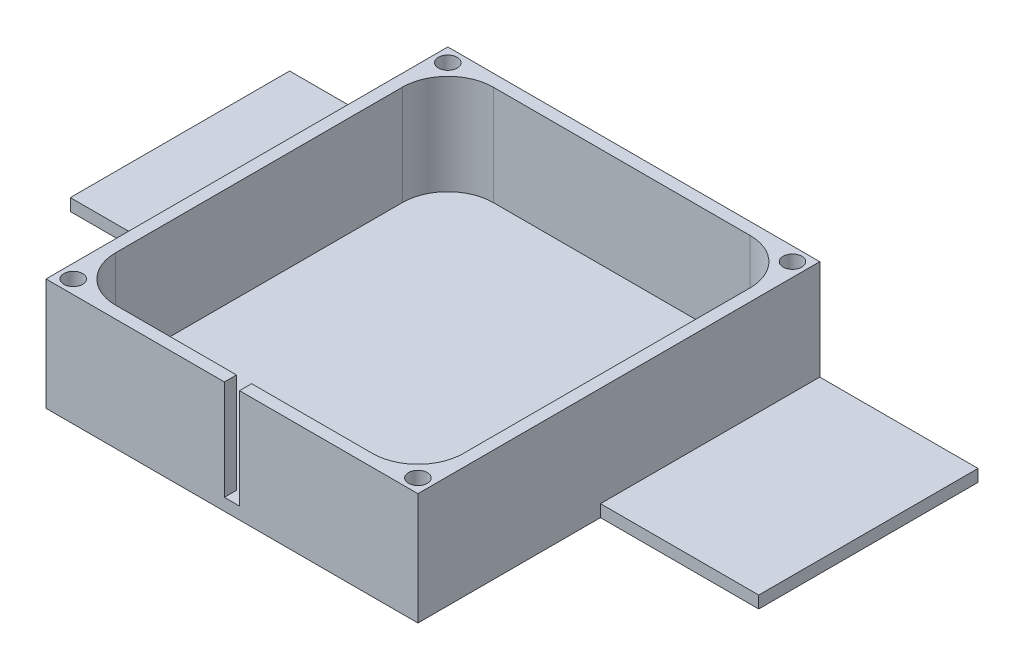
ISO-10303-21;
HEADER;
FILE_DESCRIPTION(('STEP AP214'),'2;1');
FILE_NAME('part.step','',(''),(''),'','','');
FILE_SCHEMA(('AUTOMOTIVE_DESIGN { 1 0 10303 214 1 1 1 1 }'));
ENDSEC;
DATA;
#1=APPLICATION_CONTEXT('core data for automotive mechanical design processes');
#2=APPLICATION_PROTOCOL_DEFINITION('international standard','automotive_design',2000,#1);
#3=PRODUCT_CONTEXT('',#1,'mechanical');
#4=PRODUCT('Part','Part','',(#3));
#5=PRODUCT_RELATED_PRODUCT_CATEGORY('part','',(#4));
#6=PRODUCT_DEFINITION_FORMATION('','',#4);
#7=PRODUCT_DEFINITION_CONTEXT('part definition',#1,'design');
#8=PRODUCT_DEFINITION('design','',#6,#7);
#9=PRODUCT_DEFINITION_SHAPE('','',#8);
#10=(LENGTH_UNIT() NAMED_UNIT(*) SI_UNIT(.MILLI.,.METRE.));
#11=(NAMED_UNIT(*) PLANE_ANGLE_UNIT() SI_UNIT($,.RADIAN.));
#12=(NAMED_UNIT(*) SI_UNIT($,.STERADIAN.) SOLID_ANGLE_UNIT());
#13=UNCERTAINTY_MEASURE_WITH_UNIT(LENGTH_MEASURE(1.E-05),#10,'distance_accuracy_value','');
#14=(GEOMETRIC_REPRESENTATION_CONTEXT(3) GLOBAL_UNCERTAINTY_ASSIGNED_CONTEXT((#13)) GLOBAL_UNIT_ASSIGNED_CONTEXT((#10,
#11,#12)) REPRESENTATION_CONTEXT('',''));
#15=CARTESIAN_POINT('',(0.,0.,0.));
#16=DIRECTION('',(0.,0.,1.));
#17=DIRECTION('',(1.,0.,0.));
#18=AXIS2_PLACEMENT_3D('',#15,#16,#17);
#19=CARTESIAN_POINT('',(0.,18.5,0.));
#20=DIRECTION('',(0.,1.,0.));
#21=DIRECTION('',(0.,0.,1.));
#22=AXIS2_PLACEMENT_3D('',#19,#20,#21);
#23=PLANE('',#22);
#24=CARTESIAN_POINT('',(81.7246461703273,18.5,57.3791379454559));
#25=DIRECTION('',(0.,-1.,0.));
#26=DIRECTION('',(0.,0.,-1.));
#27=AXIS2_PLACEMENT_3D('',#24,#25,#26);
#28=CIRCLE('',#27,1.55);
#29=CARTESIAN_POINT('',(81.7246461703273,18.5,55.8291379454559));
#30=VERTEX_POINT('',#29);
#31=EDGE_CURVE('E709',#30,#30,#28,.T.);
#32=ORIENTED_EDGE('',*,*,#31,.T.);
#33=EDGE_LOOP('',(#32));
#34=FACE_BOUND('',#33,.T.);
#35=CARTESIAN_POINT('',(24.8246461703273,18.5,57.3791379454559));
#36=DIRECTION('',(0.,1.,0.));
#37=DIRECTION('',(0.,0.,1.));
#38=AXIS2_PLACEMENT_3D('',#35,#36,#37);
#39=CIRCLE('',#38,1.55);
#40=CARTESIAN_POINT('',(24.8246461703273,18.5,58.9291379454559));
#41=VERTEX_POINT('',#40);
#42=EDGE_CURVE('E707',#41,#41,#39,.T.);
#43=ORIENTED_EDGE('',*,*,#42,.F.);
#44=EDGE_LOOP('',(#43));
#45=FACE_BOUND('',#44,.T.);
#46=DIRECTION('',(1.,0.,0.));
#47=VECTOR('',#46,1.);
#48=CARTESIAN_POINT('',(0.,18.5,119.469137945456));
#49=LINE('',#48,#47);
#50=CARTESIAN_POINT('',(54.5246461703273,18.5,119.469137945456));
#51=VERTEX_POINT('',#50);
#52=CARTESIAN_POINT('',(74.4746461703273,18.5,119.469137945456));
#53=VERTEX_POINT('',#52);
#54=EDGE_CURVE('E220',#51,#53,#49,.T.);
#55=ORIENTED_EDGE('',*,*,#54,.F.);
#56=DIRECTION('',(0.,0.,1.));
#57=VECTOR('',#56,1.);
#58=CARTESIAN_POINT('',(54.5246461703273,18.5,0.));
#59=LINE('',#58,#57);
#60=CARTESIAN_POINT('',(54.5246461703273,18.5,121.469137945456));
#61=VERTEX_POINT('',#60);
#62=EDGE_CURVE('E230',#51,#61,#59,.T.);
#63=ORIENTED_EDGE('',*,*,#62,.T.);
#64=DIRECTION('',(1.,0.,0.));
#65=VECTOR('',#64,1.);
#66=CARTESIAN_POINT('',(0.,18.5,121.469137945456));
#67=LINE('',#66,#65);
#68=CARTESIAN_POINT('',(83.9746461703273,18.5,121.469137945456));
#69=VERTEX_POINT('',#68);
#70=EDGE_CURVE('E235',#61,#69,#67,.T.);
#71=ORIENTED_EDGE('',*,*,#70,.T.);
#72=DIRECTION('',(0.,0.,-1.));
#73=VECTOR('',#72,1.);
#74=CARTESIAN_POINT('',(83.9746461703273,18.5,0.));
#75=LINE('',#74,#73);
#76=CARTESIAN_POINT('',(83.9746461703273,18.5,55.1291379454559));
#77=VERTEX_POINT('',#76);
#78=EDGE_CURVE('E455',#69,#77,#75,.T.);
#79=ORIENTED_EDGE('',*,*,#78,.T.);
#80=DIRECTION('',(-1.,0.,0.));
#81=VECTOR('',#80,1.);
#82=CARTESIAN_POINT('',(0.,18.5,55.1291379454559));
#83=LINE('',#82,#81);
#84=CARTESIAN_POINT('',(22.5746461703273,18.5,55.1291379454559));
#85=VERTEX_POINT('',#84);
#86=EDGE_CURVE('E456',#77,#85,#83,.T.);
#87=ORIENTED_EDGE('',*,*,#86,.T.);
#88=DIRECTION('',(0.,0.,-1.));
#89=VECTOR('',#88,1.);
#90=CARTESIAN_POINT('',(22.5746461703273,18.5,0.));
#91=LINE('',#90,#89);
#92=CARTESIAN_POINT('',(22.5746461703273,18.5,121.469137945456));
#93=VERTEX_POINT('',#92);
#94=EDGE_CURVE('E262',#93,#85,#91,.T.);
#95=ORIENTED_EDGE('',*,*,#94,.F.);
#96=CARTESIAN_POINT('',(52.0246461703273,18.5,121.469137945456));
#97=VERTEX_POINT('',#96);
#98=EDGE_CURVE('E257',#93,#97,#67,.T.);
#99=ORIENTED_EDGE('',*,*,#98,.T.);
#100=DIRECTION('',(0.,0.,1.));
#101=VECTOR('',#100,1.);
#102=CARTESIAN_POINT('',(52.0246461703273,18.5,0.));
#103=LINE('',#102,#101);
#104=CARTESIAN_POINT('',(52.0246461703273,18.5,119.469137945456));
#105=VERTEX_POINT('',#104);
#106=EDGE_CURVE('E249',#105,#97,#103,.T.);
#107=ORIENTED_EDGE('',*,*,#106,.F.);
#108=CARTESIAN_POINT('',(32.0746461703273,18.5,119.469137945456));
#109=VERTEX_POINT('',#108);
#110=EDGE_CURVE('E243',#109,#105,#49,.T.);
#111=ORIENTED_EDGE('',*,*,#110,.F.);
#112=CARTESIAN_POINT('',(32.0746461703273,18.5,111.969137945456));
#113=DIRECTION('',(0.,1.,0.));
#114=DIRECTION('',(0.,0.,1.));
#115=AXIS2_PLACEMENT_3D('',#112,#113,#114);
#116=CIRCLE('',#115,7.5);
#117=CARTESIAN_POINT('',(24.5746461703273,18.5,111.969137945456));
#118=VERTEX_POINT('',#117);
#119=EDGE_CURVE('E419',#109,#118,#116,.F.);
#120=ORIENTED_EDGE('',*,*,#119,.T.);
#121=DIRECTION('',(0.,0.,-1.));
#122=VECTOR('',#121,1.);
#123=CARTESIAN_POINT('',(24.5746461703273,18.5,0.));
#124=LINE('',#123,#122);
#125=CARTESIAN_POINT('',(24.5746461703273,18.5,64.6291379454559));
#126=VERTEX_POINT('',#125);
#127=EDGE_CURVE('E248',#118,#126,#124,.T.);
#128=ORIENTED_EDGE('',*,*,#127,.T.);
#129=CARTESIAN_POINT('',(32.0746461703273,18.5,64.6291379454559));
#130=DIRECTION('',(0.,1.,0.));
#131=DIRECTION('',(0.,0.,1.));
#132=AXIS2_PLACEMENT_3D('',#129,#130,#131);
#133=CIRCLE('',#132,7.5);
#134=CARTESIAN_POINT('',(32.0746461703273,18.5,57.1291379454559));
#135=VERTEX_POINT('',#134);
#136=EDGE_CURVE('E11',#126,#135,#133,.F.);
#137=ORIENTED_EDGE('',*,*,#136,.T.);
#138=DIRECTION('',(1.,0.,0.));
#139=VECTOR('',#138,1.);
#140=CARTESIAN_POINT('',(0.,18.5,57.1291379454559));
#141=LINE('',#140,#139);
#142=CARTESIAN_POINT('',(74.4746461703273,18.5,57.1291379454559));
#143=VERTEX_POINT('',#142);
#144=EDGE_CURVE('E254',#135,#143,#141,.T.);
#145=ORIENTED_EDGE('',*,*,#144,.T.);
#146=CARTESIAN_POINT('',(74.4746461703273,18.5,64.6291379454559));
#147=DIRECTION('',(0.,1.,0.));
#148=DIRECTION('',(0.,0.,1.));
#149=AXIS2_PLACEMENT_3D('',#146,#147,#148);
#150=CIRCLE('',#149,7.5);
#151=CARTESIAN_POINT('',(81.9746461703273,18.5,64.6291379454559));
#152=VERTEX_POINT('',#151);
#153=EDGE_CURVE('E49',#143,#152,#150,.F.);
#154=ORIENTED_EDGE('',*,*,#153,.T.);
#155=DIRECTION('',(0.,0.,-1.));
#156=VECTOR('',#155,1.);
#157=CARTESIAN_POINT('',(81.9746461703273,18.5,0.));
#158=LINE('',#157,#156);
#159=CARTESIAN_POINT('',(81.9746461703273,18.5,111.969137945456));
#160=VERTEX_POINT('',#159);
#161=EDGE_CURVE('E268',#160,#152,#158,.T.);
#162=ORIENTED_EDGE('',*,*,#161,.F.);
#163=CARTESIAN_POINT('',(74.4746461703273,18.5,111.969137945456));
#164=DIRECTION('',(0.,1.,0.));
#165=DIRECTION('',(0.,0.,1.));
#166=AXIS2_PLACEMENT_3D('',#163,#164,#165);
#167=CIRCLE('',#166,7.5);
#168=EDGE_CURVE('E240',#160,#53,#167,.F.);
#169=ORIENTED_EDGE('',*,*,#168,.T.);
#170=EDGE_LOOP('',(#55,#63,#71,#79,#87,#95,#99,#107,#111,#120,#128,#137,#145,#154,#162,#169));
#171=FACE_BOUND('',#170,.T.);
#172=CARTESIAN_POINT('',(81.7246461703273,18.5,119.219137945456));
#173=DIRECTION('',(0.,1.,0.));
#174=DIRECTION('',(0.,0.,1.));
#175=AXIS2_PLACEMENT_3D('',#172,#173,#174);
#176=CIRCLE('',#175,1.55);
#177=CARTESIAN_POINT('',(81.7246461703273,18.5,120.769137945456));
#178=VERTEX_POINT('',#177);
#179=EDGE_CURVE('E716',#178,#178,#176,.T.);
#180=ORIENTED_EDGE('',*,*,#179,.F.);
#181=EDGE_LOOP('',(#180));
#182=FACE_BOUND('',#181,.T.);
#183=CARTESIAN_POINT('',(24.8246461703273,18.5,119.219137945456));
#184=DIRECTION('',(0.,-1.,0.));
#185=DIRECTION('',(0.,0.,-1.));
#186=AXIS2_PLACEMENT_3D('',#183,#184,#185);
#187=CIRCLE('',#186,1.55);
#188=CARTESIAN_POINT('',(24.8246461703273,18.5,117.669137945456));
#189=VERTEX_POINT('',#188);
#190=EDGE_CURVE('E699',#189,#189,#187,.T.);
#191=ORIENTED_EDGE('',*,*,#190,.T.);
#192=EDGE_LOOP('',(#191));
#193=FACE_BOUND('',#192,.T.);
#194=ADVANCED_FACE('F41',(#34,#45,#171,#182,#193),#23,.T.);
#195=CARTESIAN_POINT('',(0.,2.,0.));
#196=DIRECTION('',(0.,1.,0.));
#197=DIRECTION('',(0.,0.,1.));
#198=AXIS2_PLACEMENT_3D('',#195,#196,#197);
#199=PLANE('',#198);
#200=DIRECTION('',(1.,0.,0.));
#201=VECTOR('',#200,1.);
#202=CARTESIAN_POINT('',(0.,2.,91.3291379454559));
#203=LINE('',#202,#201);
#204=CARTESIAN_POINT('',(-3.55035382967264,2.,91.3291379454559));
#205=VERTEX_POINT('',#204);
#206=CARTESIAN_POINT('',(22.5746461703273,2.,91.3291379454559));
#207=VERTEX_POINT('',#206);
#208=EDGE_CURVE('E313',#205,#207,#203,.T.);
#209=ORIENTED_EDGE('',*,*,#208,.T.);
#210=DIRECTION('',(0.,0.,-1.));
#211=VECTOR('',#210,1.);
#212=CARTESIAN_POINT('',(22.5746461703273,2.,0.));
#213=LINE('',#212,#211);
#214=CARTESIAN_POINT('',(22.5746461703273,2.,55.1291379454559));
#215=VERTEX_POINT('',#214);
#216=EDGE_CURVE('E285',#207,#215,#213,.T.);
#217=ORIENTED_EDGE('',*,*,#216,.T.);
#218=DIRECTION('',(1.,0.,0.));
#219=VECTOR('',#218,1.);
#220=CARTESIAN_POINT('',(0.,2.,55.1291379454559));
#221=LINE('',#220,#219);
#222=CARTESIAN_POINT('',(-3.55035382967265,2.,55.1291379454559));
#223=VERTEX_POINT('',#222);
#224=EDGE_CURVE('E306',#223,#215,#221,.T.);
#225=ORIENTED_EDGE('',*,*,#224,.F.);
#226=DIRECTION('',(0.,0.,1.));
#227=VECTOR('',#226,1.);
#228=CARTESIAN_POINT('',(-3.55035382967266,2.,0.));
#229=LINE('',#228,#227);
#230=EDGE_CURVE('E310',#223,#205,#229,.T.);
#231=ORIENTED_EDGE('',*,*,#230,.T.);
#232=EDGE_LOOP('',(#209,#217,#225,#231));
#233=FACE_BOUND('',#232,.T.);
#234=ADVANCED_FACE('F485',(#233),#199,.T.);
#235=DIRECTION('',(-1.,0.,0.));
#236=VECTOR('',#235,1.);
#237=CARTESIAN_POINT('',(0.,2.,55.1291379454559));
#238=LINE('',#237,#236);
#239=CARTESIAN_POINT('',(64.0437198896757,2.,55.1291379454559));
#240=VERTEX_POINT('',#239);
#241=CARTESIAN_POINT('',(42.2796461703273,2.,55.1291379454559));
#242=VERTEX_POINT('',#241);
#243=EDGE_CURVE('E281',#240,#242,#238,.T.);
#244=ORIENTED_EDGE('',*,*,#243,.F.);
#245=DIRECTION('',(0.,0.,-1.));
#246=VECTOR('',#245,1.);
#247=CARTESIAN_POINT('',(64.0437198896756,2.,-1.11098144381503E-13));
#248=LINE('',#247,#246);
#249=CARTESIAN_POINT('',(64.0437198896757,2.,47.1291379454559));
#250=VERTEX_POINT('',#249);
#251=EDGE_CURVE('E322',#240,#250,#248,.T.);
#252=ORIENTED_EDGE('',*,*,#251,.T.);
#253=DIRECTION('',(1.,0.,0.));
#254=VECTOR('',#253,1.);
#255=CARTESIAN_POINT('',(0.,2.,47.1291379454559));
#256=LINE('',#255,#254);
#257=CARTESIAN_POINT('',(42.2796461703274,2.,47.1291379454559));
#258=VERTEX_POINT('',#257);
#259=EDGE_CURVE('E324',#258,#250,#256,.T.);
#260=ORIENTED_EDGE('',*,*,#259,.F.);
#261=DIRECTION('',(0.,0.,-1.));
#262=VECTOR('',#261,1.);
#263=CARTESIAN_POINT('',(42.2796461703274,2.,0.));
#264=LINE('',#263,#262);
#265=EDGE_CURVE('E303',#242,#258,#264,.T.);
#266=ORIENTED_EDGE('',*,*,#265,.F.);
#267=EDGE_LOOP('',(#244,#252,#260,#266));
#268=FACE_BOUND('',#267,.T.);
#269=CARTESIAN_POINT('',(46.2796461703273,2.,51.1291379454559));
#270=DIRECTION('',(0.,1.,0.));
#271=DIRECTION('',(0.,0.,1.));
#272=AXIS2_PLACEMENT_3D('',#269,#270,#271);
#273=CIRCLE('',#272,1.55);
#274=CARTESIAN_POINT('',(46.2796461703273,2.,52.6791379454559));
#275=VERTEX_POINT('',#274);
#276=EDGE_CURVE('E327',#275,#275,#273,.T.);
#277=ORIENTED_EDGE('',*,*,#276,.F.);
#278=EDGE_LOOP('',(#277));
#279=FACE_BOUND('',#278,.T.);
#280=CARTESIAN_POINT('',(60.0437198896757,2.,51.1291379454559));
#281=DIRECTION('',(0.,1.,0.));
#282=DIRECTION('',(0.,0.,1.));
#283=AXIS2_PLACEMENT_3D('',#280,#281,#282);
#284=CIRCLE('',#283,1.55);
#285=CARTESIAN_POINT('',(60.0437198896757,2.,52.6791379454559));
#286=VERTEX_POINT('',#285);
#287=EDGE_CURVE('E330',#286,#286,#284,.F.);
#288=ORIENTED_EDGE('',*,*,#287,.T.);
#289=EDGE_LOOP('',(#288));
#290=FACE_BOUND('',#289,.T.);
#291=ADVANCED_FACE('F532',(#268,#279,#290),#199,.T.);
#292=DIRECTION('',(0.,0.,-1.));
#293=VECTOR('',#292,1.);
#294=CARTESIAN_POINT('',(24.5746461703273,2.,0.));
#295=LINE('',#294,#293);
#296=CARTESIAN_POINT('',(24.5746461703273,2.,111.969137945456));
#297=VERTEX_POINT('',#296);
#298=CARTESIAN_POINT('',(24.5746461703273,2.,64.6291379454559));
#299=VERTEX_POINT('',#298);
#300=EDGE_CURVE('E289',#297,#299,#295,.T.);
#301=ORIENTED_EDGE('',*,*,#300,.F.);
#302=CARTESIAN_POINT('',(32.0746461703273,2.,111.969137945456));
#303=DIRECTION('',(0.,1.,0.));
#304=DIRECTION('',(0.,0.,1.));
#305=AXIS2_PLACEMENT_3D('',#302,#303,#304);
#306=CIRCLE('',#305,7.5);
#307=CARTESIAN_POINT('',(32.0746461703273,2.,119.469137945456));
#308=VERTEX_POINT('',#307);
#309=EDGE_CURVE('E404',#297,#308,#306,.T.);
#310=ORIENTED_EDGE('',*,*,#309,.T.);
#311=DIRECTION('',(1.,0.,0.));
#312=VECTOR('',#311,1.);
#313=CARTESIAN_POINT('',(0.,2.,119.469137945456));
#314=LINE('',#313,#312);
#315=CARTESIAN_POINT('',(52.0246461703273,2.,119.469137945456));
#316=VERTEX_POINT('',#315);
#317=EDGE_CURVE('E275',#308,#316,#314,.T.);
#318=ORIENTED_EDGE('',*,*,#317,.T.);
#319=DIRECTION('',(0.,0.,1.));
#320=VECTOR('',#319,1.);
#321=CARTESIAN_POINT('',(52.0246461703273,2.,0.));
#322=LINE('',#321,#320);
#323=CARTESIAN_POINT('',(52.0246461703273,2.,121.469137945456));
#324=VERTEX_POINT('',#323);
#325=EDGE_CURVE('E277',#316,#324,#322,.T.);
#326=ORIENTED_EDGE('',*,*,#325,.T.);
#327=DIRECTION('',(1.,0.,0.));
#328=VECTOR('',#327,1.);
#329=CARTESIAN_POINT('',(0.,2.,121.469137945456));
#330=LINE('',#329,#328);
#331=CARTESIAN_POINT('',(54.5246461703273,2.,121.469137945456));
#332=VERTEX_POINT('',#331);
#333=EDGE_CURVE('E315',#324,#332,#330,.T.);
#334=ORIENTED_EDGE('',*,*,#333,.T.);
#335=DIRECTION('',(0.,0.,1.));
#336=VECTOR('',#335,1.);
#337=CARTESIAN_POINT('',(54.5246461703273,2.,0.));
#338=LINE('',#337,#336);
#339=CARTESIAN_POINT('',(54.5246461703273,2.,119.469137945456));
#340=VERTEX_POINT('',#339);
#341=EDGE_CURVE('E273',#340,#332,#338,.T.);
#342=ORIENTED_EDGE('',*,*,#341,.F.);
#343=CARTESIAN_POINT('',(74.4746461703273,2.,119.469137945456));
#344=VERTEX_POINT('',#343);
#345=EDGE_CURVE('E223',#340,#344,#314,.T.);
#346=ORIENTED_EDGE('',*,*,#345,.T.);
#347=CARTESIAN_POINT('',(74.4746461703273,2.,111.969137945456));
#348=DIRECTION('',(0.,1.,0.));
#349=DIRECTION('',(0.,0.,1.));
#350=AXIS2_PLACEMENT_3D('',#347,#348,#349);
#351=CIRCLE('',#350,7.5);
#352=CARTESIAN_POINT('',(81.9746461703273,2.,111.969137945456));
#353=VERTEX_POINT('',#352);
#354=EDGE_CURVE('E402',#344,#353,#351,.T.);
#355=ORIENTED_EDGE('',*,*,#354,.T.);
#356=DIRECTION('',(0.,0.,-1.));
#357=VECTOR('',#356,1.);
#358=CARTESIAN_POINT('',(81.9746461703273,2.,0.));
#359=LINE('',#358,#357);
#360=CARTESIAN_POINT('',(81.9746461703273,2.,64.6291379454559));
#361=VERTEX_POINT('',#360);
#362=EDGE_CURVE('E241',#353,#361,#359,.T.);
#363=ORIENTED_EDGE('',*,*,#362,.T.);
#364=CARTESIAN_POINT('',(74.4746461703273,2.,64.6291379454559));
#365=DIRECTION('',(0.,1.,0.));
#366=DIRECTION('',(0.,0.,1.));
#367=AXIS2_PLACEMENT_3D('',#364,#365,#366);
#368=CIRCLE('',#367,7.5);
#369=CARTESIAN_POINT('',(74.4746461703273,2.,57.1291379454559));
#370=VERTEX_POINT('',#369);
#371=EDGE_CURVE('E400',#361,#370,#368,.T.);
#372=ORIENTED_EDGE('',*,*,#371,.T.);
#373=DIRECTION('',(1.,0.,0.));
#374=VECTOR('',#373,1.);
#375=CARTESIAN_POINT('',(0.,2.,57.1291379454559));
#376=LINE('',#375,#374);
#377=CARTESIAN_POINT('',(32.0746461703273,2.,57.1291379454559));
#378=VERTEX_POINT('',#377);
#379=EDGE_CURVE('E245',#378,#370,#376,.T.);
#380=ORIENTED_EDGE('',*,*,#379,.F.);
#381=CARTESIAN_POINT('',(32.0746461703273,2.,64.6291379454559));
#382=DIRECTION('',(0.,1.,0.));
#383=DIRECTION('',(0.,0.,1.));
#384=AXIS2_PLACEMENT_3D('',#381,#382,#383);
#385=CIRCLE('',#384,7.5);
#386=EDGE_CURVE('E398',#378,#299,#385,.T.);
#387=ORIENTED_EDGE('',*,*,#386,.T.);
#388=EDGE_LOOP('',(#301,#310,#318,#326,#334,#342,#346,#355,#363,#372,#380,#387));
#389=FACE_BOUND('',#388,.T.);
#390=ADVANCED_FACE('F432',(#389),#199,.T.);
#391=CARTESIAN_POINT('',(42.2796461703274,2.,0.));
#392=DIRECTION('',(-1.,0.,0.));
#393=DIRECTION('',(0.,0.,1.));
#394=AXIS2_PLACEMENT_3D('',#391,#392,#393);
#395=PLANE('',#394);
#396=DIRECTION('',(0.,0.,-1.));
#397=VECTOR('',#396,1.);
#398=CARTESIAN_POINT('',(42.2796461703274,0.,0.));
#399=LINE('',#398,#397);
#400=CARTESIAN_POINT('',(42.2796461703273,0.,55.1291379454559));
#401=VERTEX_POINT('',#400);
#402=CARTESIAN_POINT('',(42.2796461703274,0.,47.1291379454559));
#403=VERTEX_POINT('',#402);
#404=EDGE_CURVE('E226',#401,#403,#399,.T.);
#405=ORIENTED_EDGE('',*,*,#404,.F.);
#406=DIRECTION('',(0.,-1.,0.));
#407=VECTOR('',#406,1.);
#408=CARTESIAN_POINT('',(42.2796461703273,2.,55.1291379454559));
#409=LINE('',#408,#407);
#410=EDGE_CURVE('E282',#242,#401,#409,.T.);
#411=ORIENTED_EDGE('',*,*,#410,.F.);
#412=ORIENTED_EDGE('',*,*,#265,.T.);
#413=DIRECTION('',(0.,-1.,0.));
#414=VECTOR('',#413,1.);
#415=CARTESIAN_POINT('',(42.2796461703274,2.,47.1291379454559));
#416=LINE('',#415,#414);
#417=EDGE_CURVE('E333',#258,#403,#416,.T.);
#418=ORIENTED_EDGE('',*,*,#417,.T.);
#419=EDGE_LOOP('',(#405,#411,#412,#418));
#420=FACE_BOUND('',#419,.T.);
#421=ADVANCED_FACE('F497',(#420),#395,.T.);
#422=CARTESIAN_POINT('',(-3.55035382967266,2.,0.));
#423=DIRECTION('',(1.,0.,0.));
#424=DIRECTION('',(0.,0.,-1.));
#425=AXIS2_PLACEMENT_3D('',#422,#423,#424);
#426=PLANE('',#425);
#427=DIRECTION('',(0.,0.,1.));
#428=VECTOR('',#427,1.);
#429=CARTESIAN_POINT('',(-3.55035382967266,0.,0.));
#430=LINE('',#429,#428);
#431=CARTESIAN_POINT('',(-3.55035382967265,0.,55.1291379454559));
#432=VERTEX_POINT('',#431);
#433=CARTESIAN_POINT('',(-3.55035382967264,0.,91.3291379454559));
#434=VERTEX_POINT('',#433);
#435=EDGE_CURVE('E339',#432,#434,#430,.T.);
#436=ORIENTED_EDGE('',*,*,#435,.T.);
#437=DIRECTION('',(0.,-1.,0.));
#438=VECTOR('',#437,1.);
#439=CARTESIAN_POINT('',(-3.55035382967264,2.,91.3291379454559));
#440=LINE('',#439,#438);
#441=EDGE_CURVE('E388',#205,#434,#440,.T.);
#442=ORIENTED_EDGE('',*,*,#441,.F.);
#443=ORIENTED_EDGE('',*,*,#230,.F.);
#444=DIRECTION('',(0.,-1.,0.));
#445=VECTOR('',#444,1.);
#446=CARTESIAN_POINT('',(-3.55035382967265,2.,55.1291379454559));
#447=LINE('',#446,#445);
#448=EDGE_CURVE('E391',#223,#432,#447,.T.);
#449=ORIENTED_EDGE('',*,*,#448,.T.);
#450=EDGE_LOOP('',(#436,#442,#443,#449));
#451=FACE_BOUND('',#450,.T.);
#452=ADVANCED_FACE('F862',(#451),#426,.F.);
#453=CARTESIAN_POINT('',(0.,2.,91.3291379454559));
#454=DIRECTION('',(0.,0.,-1.));
#455=DIRECTION('',(-1.,0.,0.));
#456=AXIS2_PLACEMENT_3D('',#453,#454,#455);
#457=PLANE('',#456);
#458=DIRECTION('',(1.,0.,0.));
#459=VECTOR('',#458,1.);
#460=CARTESIAN_POINT('',(0.,0.,91.3291379454559));
#461=LINE('',#460,#459);
#462=CARTESIAN_POINT('',(22.5746461703273,0.,91.3291379454559));
#463=VERTEX_POINT('',#462);
#464=EDGE_CURVE('E342',#434,#463,#461,.T.);
#465=ORIENTED_EDGE('',*,*,#464,.T.);
#466=DIRECTION('',(0.,-1.,0.));
#467=VECTOR('',#466,1.);
#468=CARTESIAN_POINT('',(22.5746461703273,2.,91.3291379454559));
#469=LINE('',#468,#467);
#470=EDGE_CURVE('E385',#207,#463,#469,.T.);
#471=ORIENTED_EDGE('',*,*,#470,.F.);
#472=ORIENTED_EDGE('',*,*,#208,.F.);
#473=ORIENTED_EDGE('',*,*,#441,.T.);
#474=EDGE_LOOP('',(#465,#471,#472,#473));
#475=FACE_BOUND('',#474,.T.);
#476=ADVANCED_FACE('F490',(#475),#457,.F.);
#477=CARTESIAN_POINT('',(22.5746461703273,2.,0.));
#478=DIRECTION('',(1.,0.,0.));
#479=DIRECTION('',(0.,0.,-1.));
#480=AXIS2_PLACEMENT_3D('',#477,#478,#479);
#481=PLANE('',#480);
#482=DIRECTION('',(0.,0.,1.));
#483=VECTOR('',#482,1.);
#484=CARTESIAN_POINT('',(22.5746461703273,0.,0.));
#485=LINE('',#484,#483);
#486=CARTESIAN_POINT('',(22.5746461703273,0.,121.469137945456));
#487=VERTEX_POINT('',#486);
#488=EDGE_CURVE('E344',#463,#487,#485,.T.);
#489=ORIENTED_EDGE('',*,*,#488,.T.);
#490=DIRECTION('',(0.,-1.,0.));
#491=VECTOR('',#490,1.);
#492=CARTESIAN_POINT('',(22.5746461703273,2.,121.469137945456));
#493=LINE('',#492,#491);
#494=EDGE_CURVE('E382',#93,#487,#493,.T.);
#495=ORIENTED_EDGE('',*,*,#494,.F.);
#496=ORIENTED_EDGE('',*,*,#94,.T.);
#497=DIRECTION('',(0.,-1.,0.));
#498=VECTOR('',#497,1.);
#499=CARTESIAN_POINT('',(22.5746461703273,18.5,55.1291379454559));
#500=LINE('',#499,#498);
#501=EDGE_CURVE('E296',#85,#215,#500,.T.);
#502=ORIENTED_EDGE('',*,*,#501,.T.);
#503=ORIENTED_EDGE('',*,*,#216,.F.);
#504=ORIENTED_EDGE('',*,*,#470,.T.);
#505=EDGE_LOOP('',(#489,#495,#496,#502,#503,#504));
#506=FACE_BOUND('',#505,.T.);
#507=ADVANCED_FACE('F463',(#506),#481,.F.);
#508=CARTESIAN_POINT('',(0.,2.,121.469137945456));
#509=DIRECTION('',(0.,0.,-1.));
#510=DIRECTION('',(-1.,0.,0.));
#511=AXIS2_PLACEMENT_3D('',#508,#509,#510);
#512=PLANE('',#511);
#513=DIRECTION('',(1.,0.,0.));
#514=VECTOR('',#513,1.);
#515=CARTESIAN_POINT('',(0.,0.,121.469137945456));
#516=LINE('',#515,#514);
#517=CARTESIAN_POINT('',(83.9746461703273,0.,121.469137945456));
#518=VERTEX_POINT('',#517);
#519=EDGE_CURVE('E346',#487,#518,#516,.T.);
#520=ORIENTED_EDGE('',*,*,#519,.T.);
#521=DIRECTION('',(0.,-1.,0.));
#522=VECTOR('',#521,1.);
#523=CARTESIAN_POINT('',(83.9746461703273,2.,121.469137945456));
#524=LINE('',#523,#522);
#525=EDGE_CURVE('E380',#69,#518,#524,.T.);
#526=ORIENTED_EDGE('',*,*,#525,.F.);
#527=ORIENTED_EDGE('',*,*,#70,.F.);
#528=DIRECTION('',(0.,-1.,0.));
#529=VECTOR('',#528,1.);
#530=CARTESIAN_POINT('',(54.5246461703273,18.5,121.469137945456));
#531=LINE('',#530,#529);
#532=EDGE_CURVE('E227',#61,#332,#531,.T.);
#533=ORIENTED_EDGE('',*,*,#532,.T.);
#534=ORIENTED_EDGE('',*,*,#333,.F.);
#535=DIRECTION('',(0.,-1.,0.));
#536=VECTOR('',#535,1.);
#537=CARTESIAN_POINT('',(52.0246461703273,18.5,121.469137945456));
#538=LINE('',#537,#536);
#539=EDGE_CURVE('E294',#97,#324,#538,.T.);
#540=ORIENTED_EDGE('',*,*,#539,.F.);
#541=ORIENTED_EDGE('',*,*,#98,.F.);
#542=ORIENTED_EDGE('',*,*,#494,.T.);
#543=EDGE_LOOP('',(#520,#526,#527,#533,#534,#540,#541,#542));
#544=FACE_BOUND('',#543,.T.);
#545=ADVANCED_FACE('F452',(#544),#512,.F.);
#546=CARTESIAN_POINT('',(83.9746461703273,2.,0.));
#547=DIRECTION('',(1.,0.,0.));
#548=DIRECTION('',(0.,0.,-1.));
#549=AXIS2_PLACEMENT_3D('',#546,#547,#548);
#550=PLANE('',#549);
#551=DIRECTION('',(0.,0.,1.));
#552=VECTOR('',#551,1.);
#553=CARTESIAN_POINT('',(83.9746461703273,0.,0.));
#554=LINE('',#553,#552);
#555=CARTESIAN_POINT('',(83.9746461703273,0.,91.3291379454559));
#556=VERTEX_POINT('',#555);
#557=EDGE_CURVE('E349',#556,#518,#554,.T.);
#558=ORIENTED_EDGE('',*,*,#557,.F.);
#559=DIRECTION('',(0.,-1.,0.));
#560=VECTOR('',#559,1.);
#561=CARTESIAN_POINT('',(83.9746461703273,2.,91.3291379454559));
#562=LINE('',#561,#560);
#563=CARTESIAN_POINT('',(83.9746461703273,2.,91.3291379454559));
#564=VERTEX_POINT('',#563);
#565=EDGE_CURVE('E378',#564,#556,#562,.T.);
#566=ORIENTED_EDGE('',*,*,#565,.F.);
#567=DIRECTION('',(0.,0.,-1.));
#568=VECTOR('',#567,1.);
#569=CARTESIAN_POINT('',(83.9746461703273,2.,0.));
#570=LINE('',#569,#568);
#571=CARTESIAN_POINT('',(83.9746461703273,2.,55.1291379454559));
#572=VERTEX_POINT('',#571);
#573=EDGE_CURVE('E278',#564,#572,#570,.T.);
#574=ORIENTED_EDGE('',*,*,#573,.T.);
#575=DIRECTION('',(0.,-1.,0.));
#576=VECTOR('',#575,1.);
#577=CARTESIAN_POINT('',(83.9746461703273,18.5,55.1291379454559));
#578=LINE('',#577,#576);
#579=EDGE_CURVE('E299',#77,#572,#578,.T.);
#580=ORIENTED_EDGE('',*,*,#579,.F.);
#581=ORIENTED_EDGE('',*,*,#78,.F.);
#582=ORIENTED_EDGE('',*,*,#525,.T.);
#583=EDGE_LOOP('',(#558,#566,#574,#580,#581,#582));
#584=FACE_BOUND('',#583,.T.);
#585=ADVANCED_FACE('F475',(#584),#550,.T.);
#586=CARTESIAN_POINT('',(0.,2.,91.3291379454559));
#587=DIRECTION('',(0.,0.,-1.));
#588=DIRECTION('',(-1.,0.,0.));
#589=AXIS2_PLACEMENT_3D('',#586,#587,#588);
#590=PLANE('',#589);
#591=DIRECTION('',(1.,0.,0.));
#592=VECTOR('',#591,1.);
#593=CARTESIAN_POINT('',(0.,0.,91.3291379454559));
#594=LINE('',#593,#592);
#595=CARTESIAN_POINT('',(110.099646170327,0.,91.3291379454559));
#596=VERTEX_POINT('',#595);
#597=EDGE_CURVE('E352',#556,#596,#594,.T.);
#598=ORIENTED_EDGE('',*,*,#597,.T.);
#599=DIRECTION('',(0.,-1.,0.));
#600=VECTOR('',#599,1.);
#601=CARTESIAN_POINT('',(110.099646170327,2.,91.3291379454559));
#602=LINE('',#601,#600);
#603=CARTESIAN_POINT('',(110.099646170327,2.,91.3291379454559));
#604=VERTEX_POINT('',#603);
#605=EDGE_CURVE('E376',#604,#596,#602,.T.);
#606=ORIENTED_EDGE('',*,*,#605,.F.);
#607=DIRECTION('',(1.,0.,0.));
#608=VECTOR('',#607,1.);
#609=CARTESIAN_POINT('',(0.,2.,91.3291379454559));
#610=LINE('',#609,#608);
#611=EDGE_CURVE('E317',#564,#604,#610,.T.);
#612=ORIENTED_EDGE('',*,*,#611,.F.);
#613=ORIENTED_EDGE('',*,*,#565,.T.);
#614=EDGE_LOOP('',(#598,#606,#612,#613));
#615=FACE_BOUND('',#614,.T.);
#616=ADVANCED_FACE('F515',(#615),#590,.F.);
#617=CARTESIAN_POINT('',(110.099646170327,2.,0.));
#618=DIRECTION('',(1.,0.,0.));
#619=DIRECTION('',(0.,0.,-1.));
#620=AXIS2_PLACEMENT_3D('',#617,#618,#619);
#621=PLANE('',#620);
#622=DIRECTION('',(0.,0.,1.));
#623=VECTOR('',#622,1.);
#624=CARTESIAN_POINT('',(110.099646170327,0.,0.));
#625=LINE('',#624,#623);
#626=CARTESIAN_POINT('',(110.099646170327,0.,55.1291379454559));
#627=VERTEX_POINT('',#626);
#628=EDGE_CURVE('E355',#627,#596,#625,.T.);
#629=ORIENTED_EDGE('',*,*,#628,.F.);
#630=DIRECTION('',(0.,-1.,0.));
#631=VECTOR('',#630,1.);
#632=CARTESIAN_POINT('',(110.099646170327,2.,55.1291379454559));
#633=LINE('',#632,#631);
#634=CARTESIAN_POINT('',(110.099646170327,2.,55.1291379454559));
#635=VERTEX_POINT('',#634);
#636=EDGE_CURVE('E374',#635,#627,#633,.T.);
#637=ORIENTED_EDGE('',*,*,#636,.F.);
#638=DIRECTION('',(0.,0.,1.));
#639=VECTOR('',#638,1.);
#640=CARTESIAN_POINT('',(110.099646170327,2.,0.));
#641=LINE('',#640,#639);
#642=EDGE_CURVE('E319',#635,#604,#641,.T.);
#643=ORIENTED_EDGE('',*,*,#642,.T.);
#644=ORIENTED_EDGE('',*,*,#605,.T.);
#645=EDGE_LOOP('',(#629,#637,#643,#644));
#646=FACE_BOUND('',#645,.T.);
#647=ADVANCED_FACE('F512',(#646),#621,.T.);
#648=CARTESIAN_POINT('',(0.,2.,55.1291379454559));
#649=DIRECTION('',(0.,0.,-1.));
#650=DIRECTION('',(-1.,0.,0.));
#651=AXIS2_PLACEMENT_3D('',#648,#649,#650);
#652=PLANE('',#651);
#653=DIRECTION('',(1.,0.,0.));
#654=VECTOR('',#653,1.);
#655=CARTESIAN_POINT('',(0.,0.,55.1291379454559));
#656=LINE('',#655,#654);
#657=CARTESIAN_POINT('',(64.0437198896757,0.,55.1291379454559));
#658=VERTEX_POINT('',#657);
#659=EDGE_CURVE('E340',#658,#627,#656,.T.);
#660=ORIENTED_EDGE('',*,*,#659,.F.);
#661=DIRECTION('',(0.,-1.,0.));
#662=VECTOR('',#661,1.);
#663=CARTESIAN_POINT('',(64.0437198896757,2.,55.1291379454559));
#664=LINE('',#663,#662);
#665=EDGE_CURVE('E372',#240,#658,#664,.T.);
#666=ORIENTED_EDGE('',*,*,#665,.F.);
#667=ORIENTED_EDGE('',*,*,#243,.T.);
#668=ORIENTED_EDGE('',*,*,#410,.T.);
#669=EDGE_CURVE('E336',#432,#401,#656,.T.);
#670=ORIENTED_EDGE('',*,*,#669,.F.);
#671=ORIENTED_EDGE('',*,*,#448,.F.);
#672=ORIENTED_EDGE('',*,*,#224,.T.);
#673=ORIENTED_EDGE('',*,*,#501,.F.);
#674=ORIENTED_EDGE('',*,*,#86,.F.);
#675=ORIENTED_EDGE('',*,*,#579,.T.);
#676=EDGE_CURVE('E311',#572,#635,#221,.T.);
#677=ORIENTED_EDGE('',*,*,#676,.T.);
#678=ORIENTED_EDGE('',*,*,#636,.T.);
#679=EDGE_LOOP('',(#660,#666,#667,#668,#670,#671,#672,#673,#674,#675,#677,#678));
#680=FACE_BOUND('',#679,.T.);
#681=ADVANCED_FACE('F480',(#680),#652,.T.);
#682=CARTESIAN_POINT('',(64.0437198896756,2.,-1.11098144381503E-13));
#683=DIRECTION('',(-1.,0.,0.));
#684=DIRECTION('',(0.,0.,1.));
#685=AXIS2_PLACEMENT_3D('',#682,#683,#684);
#686=PLANE('',#685);
#687=DIRECTION('',(0.,0.,-1.));
#688=VECTOR('',#687,1.);
#689=CARTESIAN_POINT('',(64.0437198896756,0.,-1.11098144381503E-13));
#690=LINE('',#689,#688);
#691=CARTESIAN_POINT('',(64.0437198896757,0.,47.1291379454559));
#692=VERTEX_POINT('',#691);
#693=EDGE_CURVE('E358',#658,#692,#690,.T.);
#694=ORIENTED_EDGE('',*,*,#693,.T.);
#695=DIRECTION('',(0.,-1.,0.));
#696=VECTOR('',#695,1.);
#697=CARTESIAN_POINT('',(64.0437198896757,2.,47.1291379454559));
#698=LINE('',#697,#696);
#699=EDGE_CURVE('E370',#250,#692,#698,.T.);
#700=ORIENTED_EDGE('',*,*,#699,.F.);
#701=ORIENTED_EDGE('',*,*,#251,.F.);
#702=ORIENTED_EDGE('',*,*,#665,.T.);
#703=EDGE_LOOP('',(#694,#700,#701,#702));
#704=FACE_BOUND('',#703,.T.);
#705=ADVANCED_FACE('F506',(#704),#686,.F.);
#706=CARTESIAN_POINT('',(46.2796461703273,2.,51.1291379454559));
#707=DIRECTION('',(0.,-1.,0.));
#708=DIRECTION('',(0.,0.,-1.));
#709=AXIS2_PLACEMENT_3D('',#706,#707,#708);
#710=CYLINDRICAL_SURFACE('',#709,1.55);
#711=ORIENTED_EDGE('',*,*,#276,.T.);
#712=EDGE_LOOP('',(#711));
#713=FACE_BOUND('',#712,.T.);
#714=CARTESIAN_POINT('',(46.2796461703273,0.,51.1291379454559));
#715=DIRECTION('',(0.,1.,0.));
#716=DIRECTION('',(0.,0.,1.));
#717=AXIS2_PLACEMENT_3D('',#714,#715,#716);
#718=CIRCLE('',#717,1.55);
#719=CARTESIAN_POINT('',(46.2796461703273,0.,52.6791379454559));
#720=VERTEX_POINT('',#719);
#721=EDGE_CURVE('E364',#720,#720,#718,.T.);
#722=ORIENTED_EDGE('',*,*,#721,.F.);
#723=EDGE_LOOP('',(#722));
#724=FACE_BOUND('',#723,.T.);
#725=ADVANCED_FACE('F793',(#713,#724),#710,.F.);
#726=CARTESIAN_POINT('',(0.,2.,47.1291379454559));
#727=DIRECTION('',(0.,0.,-1.));
#728=DIRECTION('',(-1.,0.,0.));
#729=AXIS2_PLACEMENT_3D('',#726,#727,#728);
#730=PLANE('',#729);
#731=DIRECTION('',(1.,0.,0.));
#732=VECTOR('',#731,1.);
#733=CARTESIAN_POINT('',(0.,0.,47.1291379454559));
#734=LINE('',#733,#732);
#735=EDGE_CURVE('E361',#403,#692,#734,.T.);
#736=ORIENTED_EDGE('',*,*,#735,.F.);
#737=ORIENTED_EDGE('',*,*,#417,.F.);
#738=ORIENTED_EDGE('',*,*,#259,.T.);
#739=ORIENTED_EDGE('',*,*,#699,.T.);
#740=EDGE_LOOP('',(#736,#737,#738,#739));
#741=FACE_BOUND('',#740,.T.);
#742=ADVANCED_FACE('F501',(#741),#730,.T.);
#743=CARTESIAN_POINT('',(60.0437198896757,2.,51.1291379454559));
#744=DIRECTION('',(0.,-1.,0.));
#745=DIRECTION('',(0.,0.,-1.));
#746=AXIS2_PLACEMENT_3D('',#743,#744,#745);
#747=CYLINDRICAL_SURFACE('',#746,1.55);
#748=ORIENTED_EDGE('',*,*,#287,.F.);
#749=EDGE_LOOP('',(#748));
#750=FACE_BOUND('',#749,.T.);
#751=CARTESIAN_POINT('',(60.0437198896757,0.,51.1291379454559));
#752=DIRECTION('',(0.,1.,0.));
#753=DIRECTION('',(0.,0.,1.));
#754=AXIS2_PLACEMENT_3D('',#751,#752,#753);
#755=CIRCLE('',#754,1.55);
#756=CARTESIAN_POINT('',(60.0437198896757,0.,52.6791379454559));
#757=VERTEX_POINT('',#756);
#758=EDGE_CURVE('E307',#757,#757,#755,.F.);
#759=ORIENTED_EDGE('',*,*,#758,.T.);
#760=EDGE_LOOP('',(#759));
#761=FACE_BOUND('',#760,.T.);
#762=ADVANCED_FACE('F519',(#750,#761),#747,.F.);
#763=ORIENTED_EDGE('',*,*,#573,.F.);
#764=ORIENTED_EDGE('',*,*,#611,.T.);
#765=ORIENTED_EDGE('',*,*,#642,.F.);
#766=ORIENTED_EDGE('',*,*,#676,.F.);
#767=EDGE_LOOP('',(#763,#764,#765,#766));
#768=FACE_BOUND('',#767,.T.);
#769=ADVANCED_FACE('F517',(#768),#199,.T.);
#770=CARTESIAN_POINT('',(0.,0.,0.));
#771=DIRECTION('',(0.,1.,0.));
#772=DIRECTION('',(0.,0.,1.));
#773=AXIS2_PLACEMENT_3D('',#770,#771,#772);
#774=PLANE('',#773);
#775=ORIENTED_EDGE('',*,*,#404,.T.);
#776=ORIENTED_EDGE('',*,*,#735,.T.);
#777=ORIENTED_EDGE('',*,*,#693,.F.);
#778=ORIENTED_EDGE('',*,*,#659,.T.);
#779=ORIENTED_EDGE('',*,*,#628,.T.);
#780=ORIENTED_EDGE('',*,*,#597,.F.);
#781=ORIENTED_EDGE('',*,*,#557,.T.);
#782=ORIENTED_EDGE('',*,*,#519,.F.);
#783=ORIENTED_EDGE('',*,*,#488,.F.);
#784=ORIENTED_EDGE('',*,*,#464,.F.);
#785=ORIENTED_EDGE('',*,*,#435,.F.);
#786=ORIENTED_EDGE('',*,*,#669,.T.);
#787=EDGE_LOOP('',(#775,#776,#777,#778,#779,#780,#781,#782,#783,#784,#785,#786));
#788=FACE_BOUND('',#787,.T.);
#789=ORIENTED_EDGE('',*,*,#721,.T.);
#790=EDGE_LOOP('',(#789));
#791=FACE_BOUND('',#790,.T.);
#792=ORIENTED_EDGE('',*,*,#758,.F.);
#793=EDGE_LOOP('',(#792));
#794=FACE_BOUND('',#793,.T.);
#795=ADVANCED_FACE('F468',(#788,#791,#794),#774,.F.);
#796=CARTESIAN_POINT('',(0.,18.5,119.469137945456));
#797=DIRECTION('',(0.,0.,-1.));
#798=DIRECTION('',(-1.,0.,0.));
#799=AXIS2_PLACEMENT_3D('',#796,#797,#798);
#800=PLANE('',#799);
#801=ORIENTED_EDGE('',*,*,#54,.T.);
#802=DIRECTION('',(0.,-1.,0.));
#803=VECTOR('',#802,1.);
#804=CARTESIAN_POINT('',(74.4746461703273,2.,119.469137945456));
#805=LINE('',#804,#803);
#806=EDGE_CURVE('E408',#53,#344,#805,.T.);
#807=ORIENTED_EDGE('',*,*,#806,.T.);
#808=ORIENTED_EDGE('',*,*,#345,.F.);
#809=DIRECTION('',(0.,-1.,0.));
#810=VECTOR('',#809,1.);
#811=CARTESIAN_POINT('',(54.5246461703273,18.5,119.469137945456));
#812=LINE('',#811,#810);
#813=EDGE_CURVE('E215',#51,#340,#812,.T.);
#814=ORIENTED_EDGE('',*,*,#813,.F.);
#815=EDGE_LOOP('',(#801,#807,#808,#814));
#816=FACE_BOUND('',#815,.T.);
#817=ADVANCED_FACE('F217',(#816),#800,.T.);
#818=CARTESIAN_POINT('',(54.5246461703273,18.5,0.));
#819=DIRECTION('',(1.,0.,0.));
#820=DIRECTION('',(0.,0.,-1.));
#821=AXIS2_PLACEMENT_3D('',#818,#819,#820);
#822=PLANE('',#821);
#823=ORIENTED_EDGE('',*,*,#341,.T.);
#824=ORIENTED_EDGE('',*,*,#532,.F.);
#825=ORIENTED_EDGE('',*,*,#62,.F.);
#826=ORIENTED_EDGE('',*,*,#813,.T.);
#827=EDGE_LOOP('',(#823,#824,#825,#826));
#828=FACE_BOUND('',#827,.T.);
#829=ADVANCED_FACE('F231',(#828),#822,.F.);
#830=CARTESIAN_POINT('',(52.0246461703273,18.5,0.));
#831=DIRECTION('',(1.,0.,0.));
#832=DIRECTION('',(0.,0.,-1.));
#833=AXIS2_PLACEMENT_3D('',#830,#831,#832);
#834=PLANE('',#833);
#835=ORIENTED_EDGE('',*,*,#325,.F.);
#836=DIRECTION('',(0.,-1.,0.));
#837=VECTOR('',#836,1.);
#838=CARTESIAN_POINT('',(52.0246461703273,18.5,119.469137945456));
#839=LINE('',#838,#837);
#840=EDGE_CURVE('E271',#105,#316,#839,.T.);
#841=ORIENTED_EDGE('',*,*,#840,.F.);
#842=ORIENTED_EDGE('',*,*,#106,.T.);
#843=ORIENTED_EDGE('',*,*,#539,.T.);
#844=EDGE_LOOP('',(#835,#841,#842,#843));
#845=FACE_BOUND('',#844,.T.);
#846=ADVANCED_FACE('F448',(#845),#834,.T.);
#847=ORIENTED_EDGE('',*,*,#317,.F.);
#848=DIRECTION('',(0.,-1.,0.));
#849=VECTOR('',#848,1.);
#850=CARTESIAN_POINT('',(32.0746461703273,18.5,119.469137945456));
#851=LINE('',#850,#849);
#852=EDGE_CURVE('E406',#308,#109,#851,.F.);
#853=ORIENTED_EDGE('',*,*,#852,.T.);
#854=ORIENTED_EDGE('',*,*,#110,.T.);
#855=ORIENTED_EDGE('',*,*,#840,.T.);
#856=EDGE_LOOP('',(#847,#853,#854,#855));
#857=FACE_BOUND('',#856,.T.);
#858=ADVANCED_FACE('F446',(#857),#800,.T.);
#859=CARTESIAN_POINT('',(24.5746461703273,18.5,0.));
#860=DIRECTION('',(-1.,0.,0.));
#861=DIRECTION('',(0.,0.,1.));
#862=AXIS2_PLACEMENT_3D('',#859,#860,#861);
#863=PLANE('',#862);
#864=ORIENTED_EDGE('',*,*,#127,.F.);
#865=DIRECTION('',(0.,-1.,0.));
#866=VECTOR('',#865,1.);
#867=CARTESIAN_POINT('',(24.5746461703273,18.5,111.969137945456));
#868=LINE('',#867,#866);
#869=EDGE_CURVE('E395',#118,#297,#868,.T.);
#870=ORIENTED_EDGE('',*,*,#869,.T.);
#871=ORIENTED_EDGE('',*,*,#300,.T.);
#872=DIRECTION('',(0.,-1.,0.));
#873=VECTOR('',#872,1.);
#874=CARTESIAN_POINT('',(24.5746461703273,18.5,64.6291379454559));
#875=LINE('',#874,#873);
#876=EDGE_CURVE('E287',#299,#126,#875,.F.);
#877=ORIENTED_EDGE('',*,*,#876,.T.);
#878=EDGE_LOOP('',(#864,#870,#871,#877));
#879=FACE_BOUND('',#878,.T.);
#880=ADVANCED_FACE('F439',(#879),#863,.F.);
#881=CARTESIAN_POINT('',(0.,18.5,57.1291379454559));
#882=DIRECTION('',(0.,0.,-1.));
#883=DIRECTION('',(-1.,0.,0.));
#884=AXIS2_PLACEMENT_3D('',#881,#882,#883);
#885=PLANE('',#884);
#886=ORIENTED_EDGE('',*,*,#379,.T.);
#887=DIRECTION('',(0.,-1.,0.));
#888=VECTOR('',#887,1.);
#889=CARTESIAN_POINT('',(74.4746461703273,18.5,57.1291379454559));
#890=LINE('',#889,#888);
#891=EDGE_CURVE('E56',#370,#143,#890,.F.);
#892=ORIENTED_EDGE('',*,*,#891,.T.);
#893=ORIENTED_EDGE('',*,*,#144,.F.);
#894=DIRECTION('',(0.,-1.,0.));
#895=VECTOR('',#894,1.);
#896=CARTESIAN_POINT('',(32.0746461703273,2.,57.1291379454559));
#897=LINE('',#896,#895);
#898=EDGE_CURVE('E415',#135,#378,#897,.T.);
#899=ORIENTED_EDGE('',*,*,#898,.T.);
#900=EDGE_LOOP('',(#886,#892,#893,#899));
#901=FACE_BOUND('',#900,.T.);
#902=ADVANCED_FACE('F433',(#901),#885,.F.);
#903=CARTESIAN_POINT('',(81.9746461703273,18.5,0.));
#904=DIRECTION('',(-1.,0.,0.));
#905=DIRECTION('',(0.,0.,1.));
#906=AXIS2_PLACEMENT_3D('',#903,#904,#905);
#907=PLANE('',#906);
#908=ORIENTED_EDGE('',*,*,#362,.F.);
#909=DIRECTION('',(0.,-1.,0.));
#910=VECTOR('',#909,1.);
#911=CARTESIAN_POINT('',(81.9746461703273,18.5,111.969137945456));
#912=LINE('',#911,#910);
#913=EDGE_CURVE('E413',#353,#160,#912,.F.);
#914=ORIENTED_EDGE('',*,*,#913,.T.);
#915=ORIENTED_EDGE('',*,*,#161,.T.);
#916=DIRECTION('',(0.,-1.,0.));
#917=VECTOR('',#916,1.);
#918=CARTESIAN_POINT('',(81.9746461703273,18.5,64.6291379454559));
#919=LINE('',#918,#917);
#920=EDGE_CURVE('E410',#152,#361,#919,.T.);
#921=ORIENTED_EDGE('',*,*,#920,.T.);
#922=EDGE_LOOP('',(#908,#914,#915,#921));
#923=FACE_BOUND('',#922,.T.);
#924=ADVANCED_FACE('F426',(#923),#907,.T.);
#925=CARTESIAN_POINT('',(32.0746461703273,18.5,111.969137945456));
#926=DIRECTION('',(0.,-1.,0.));
#927=DIRECTION('',(0.,0.,-1.));
#928=AXIS2_PLACEMENT_3D('',#925,#926,#927);
#929=CYLINDRICAL_SURFACE('',#928,7.5);
#930=ORIENTED_EDGE('',*,*,#119,.F.);
#931=ORIENTED_EDGE('',*,*,#852,.F.);
#932=ORIENTED_EDGE('',*,*,#309,.F.);
#933=ORIENTED_EDGE('',*,*,#869,.F.);
#934=EDGE_LOOP('',(#930,#931,#932,#933));
#935=FACE_BOUND('',#934,.T.);
#936=ADVANCED_FACE('F443',(#935),#929,.F.);
#937=CARTESIAN_POINT('',(74.4746461703273,18.5,111.969137945456));
#938=DIRECTION('',(0.,1.,0.));
#939=DIRECTION('',(0.,0.,1.));
#940=AXIS2_PLACEMENT_3D('',#937,#938,#939);
#941=CYLINDRICAL_SURFACE('',#940,7.5);
#942=ORIENTED_EDGE('',*,*,#168,.F.);
#943=ORIENTED_EDGE('',*,*,#913,.F.);
#944=ORIENTED_EDGE('',*,*,#354,.F.);
#945=ORIENTED_EDGE('',*,*,#806,.F.);
#946=EDGE_LOOP('',(#942,#943,#944,#945));
#947=FACE_BOUND('',#946,.T.);
#948=ADVANCED_FACE('F592',(#947),#941,.F.);
#949=CARTESIAN_POINT('',(74.4746461703273,18.5,64.6291379454559));
#950=DIRECTION('',(0.,-1.,0.));
#951=DIRECTION('',(0.,0.,-1.));
#952=AXIS2_PLACEMENT_3D('',#949,#950,#951);
#953=CYLINDRICAL_SURFACE('',#952,7.5);
#954=ORIENTED_EDGE('',*,*,#153,.F.);
#955=ORIENTED_EDGE('',*,*,#891,.F.);
#956=ORIENTED_EDGE('',*,*,#371,.F.);
#957=ORIENTED_EDGE('',*,*,#920,.F.);
#958=EDGE_LOOP('',(#954,#955,#956,#957));
#959=FACE_BOUND('',#958,.T.);
#960=ADVANCED_FACE('F428',(#959),#953,.F.);
#961=CARTESIAN_POINT('',(32.0746461703273,18.5,64.6291379454559));
#962=DIRECTION('',(0.,1.,0.));
#963=DIRECTION('',(0.,0.,1.));
#964=AXIS2_PLACEMENT_3D('',#961,#962,#963);
#965=CYLINDRICAL_SURFACE('',#964,7.5);
#966=ORIENTED_EDGE('',*,*,#136,.F.);
#967=ORIENTED_EDGE('',*,*,#876,.F.);
#968=ORIENTED_EDGE('',*,*,#386,.F.);
#969=ORIENTED_EDGE('',*,*,#898,.F.);
#970=EDGE_LOOP('',(#966,#967,#968,#969));
#971=FACE_BOUND('',#970,.T.);
#972=ADVANCED_FACE('F43',(#971),#965,.F.);
#973=CARTESIAN_POINT('',(24.8246461703273,8.5,57.3791379454559));
#974=DIRECTION('',(0.,1.,0.));
#975=DIRECTION('',(0.,0.,1.));
#976=AXIS2_PLACEMENT_3D('',#973,#974,#975);
#977=CYLINDRICAL_SURFACE('',#976,1.55);
#978=CARTESIAN_POINT('',(24.8246461703273,8.5,57.3791379454559));
#979=DIRECTION('',(0.,1.,0.));
#980=DIRECTION('',(0.,0.,1.));
#981=AXIS2_PLACEMENT_3D('',#978,#979,#980);
#982=CIRCLE('',#981,1.55);
#983=CARTESIAN_POINT('',(24.8246461703273,8.5,58.9291379454559));
#984=VERTEX_POINT('',#983);
#985=EDGE_CURVE('E274',#984,#984,#982,.T.);
#986=ORIENTED_EDGE('',*,*,#985,.F.);
#987=EDGE_LOOP('',(#986));
#988=FACE_BOUND('',#987,.T.);
#989=ORIENTED_EDGE('',*,*,#42,.T.);
#990=EDGE_LOOP('',(#989));
#991=FACE_BOUND('',#990,.T.);
#992=ADVANCED_FACE('F545',(#988,#991),#977,.F.);
#993=CARTESIAN_POINT('',(24.8246461703273,8.5,57.3791379454559));
#994=DIRECTION('',(0.,1.,0.));
#995=DIRECTION('',(0.,0.,1.));
#996=AXIS2_PLACEMENT_3D('',#993,#994,#995);
#997=PLANE('',#996);
#998=ORIENTED_EDGE('',*,*,#985,.T.);
#999=EDGE_LOOP('',(#998));
#1000=FACE_BOUND('',#999,.T.);
#1001=ADVANCED_FACE('F625',(#1000),#997,.T.);
#1002=CARTESIAN_POINT('',(81.7246461703273,8.5,57.3791379454559));
#1003=DIRECTION('',(0.,1.,0.));
#1004=DIRECTION('',(0.,0.,1.));
#1005=AXIS2_PLACEMENT_3D('',#1002,#1003,#1004);
#1006=CYLINDRICAL_SURFACE('',#1005,1.55);
#1007=CARTESIAN_POINT('',(81.7246461703273,8.5,57.3791379454559));
#1008=DIRECTION('',(0.,-1.,0.));
#1009=DIRECTION('',(0.,0.,-1.));
#1010=AXIS2_PLACEMENT_3D('',#1007,#1008,#1009);
#1011=CIRCLE('',#1010,1.55);
#1012=CARTESIAN_POINT('',(81.7246461703273,8.5,55.8291379454559));
#1013=VERTEX_POINT('',#1012);
#1014=EDGE_CURVE('E712',#1013,#1013,#1011,.T.);
#1015=ORIENTED_EDGE('',*,*,#1014,.T.);
#1016=EDGE_LOOP('',(#1015));
#1017=FACE_BOUND('',#1016,.T.);
#1018=ORIENTED_EDGE('',*,*,#31,.F.);
#1019=EDGE_LOOP('',(#1018));
#1020=FACE_BOUND('',#1019,.T.);
#1021=ADVANCED_FACE('F634',(#1017,#1020),#1006,.F.);
#1022=CARTESIAN_POINT('',(81.7246461703273,8.5,57.3791379454559));
#1023=DIRECTION('',(0.,-1.,0.));
#1024=DIRECTION('',(0.,0.,-1.));
#1025=AXIS2_PLACEMENT_3D('',#1022,#1023,#1024);
#1026=PLANE('',#1025);
#1027=ORIENTED_EDGE('',*,*,#1014,.F.);
#1028=EDGE_LOOP('',(#1027));
#1029=FACE_BOUND('',#1028,.T.);
#1030=ADVANCED_FACE('F643',(#1029),#1026,.F.);
#1031=CARTESIAN_POINT('',(81.7246461703273,8.5,119.219137945456));
#1032=DIRECTION('',(0.,1.,0.));
#1033=DIRECTION('',(0.,0.,1.));
#1034=AXIS2_PLACEMENT_3D('',#1031,#1032,#1033);
#1035=CYLINDRICAL_SURFACE('',#1034,1.55);
#1036=CARTESIAN_POINT('',(81.7246461703273,8.5,119.219137945456));
#1037=DIRECTION('',(0.,1.,0.));
#1038=DIRECTION('',(0.,0.,1.));
#1039=AXIS2_PLACEMENT_3D('',#1036,#1037,#1038);
#1040=CIRCLE('',#1039,1.55);
#1041=CARTESIAN_POINT('',(81.7246461703273,8.5,120.769137945456));
#1042=VERTEX_POINT('',#1041);
#1043=EDGE_CURVE('E702',#1042,#1042,#1040,.T.);
#1044=ORIENTED_EDGE('',*,*,#1043,.F.);
#1045=EDGE_LOOP('',(#1044));
#1046=FACE_BOUND('',#1045,.T.);
#1047=ORIENTED_EDGE('',*,*,#179,.T.);
#1048=EDGE_LOOP('',(#1047));
#1049=FACE_BOUND('',#1048,.T.);
#1050=ADVANCED_FACE('F653',(#1046,#1049),#1035,.F.);
#1051=CARTESIAN_POINT('',(81.7246461703273,8.5,119.219137945456));
#1052=DIRECTION('',(0.,1.,0.));
#1053=DIRECTION('',(0.,0.,1.));
#1054=AXIS2_PLACEMENT_3D('',#1051,#1052,#1053);
#1055=PLANE('',#1054);
#1056=ORIENTED_EDGE('',*,*,#1043,.T.);
#1057=EDGE_LOOP('',(#1056));
#1058=FACE_BOUND('',#1057,.T.);
#1059=ADVANCED_FACE('F663',(#1058),#1055,.T.);
#1060=CARTESIAN_POINT('',(24.8246461703273,8.5,119.219137945456));
#1061=DIRECTION('',(0.,1.,0.));
#1062=DIRECTION('',(0.,0.,1.));
#1063=AXIS2_PLACEMENT_3D('',#1060,#1061,#1062);
#1064=CYLINDRICAL_SURFACE('',#1063,1.55);
#1065=CARTESIAN_POINT('',(24.8246461703273,8.5,119.219137945456));
#1066=DIRECTION('',(0.,-1.,0.));
#1067=DIRECTION('',(0.,0.,-1.));
#1068=AXIS2_PLACEMENT_3D('',#1065,#1066,#1067);
#1069=CIRCLE('',#1068,1.55);
#1070=CARTESIAN_POINT('',(24.8246461703273,8.5,117.669137945456));
#1071=VERTEX_POINT('',#1070);
#1072=EDGE_CURVE('E698',#1071,#1071,#1069,.T.);
#1073=ORIENTED_EDGE('',*,*,#1072,.T.);
#1074=EDGE_LOOP('',(#1073));
#1075=FACE_BOUND('',#1074,.T.);
#1076=ORIENTED_EDGE('',*,*,#190,.F.);
#1077=EDGE_LOOP('',(#1076));
#1078=FACE_BOUND('',#1077,.T.);
#1079=ADVANCED_FACE('F673',(#1075,#1078),#1064,.F.);
#1080=CARTESIAN_POINT('',(24.8246461703273,8.5,119.219137945456));
#1081=DIRECTION('',(0.,-1.,0.));
#1082=DIRECTION('',(0.,0.,-1.));
#1083=AXIS2_PLACEMENT_3D('',#1080,#1081,#1082);
#1084=PLANE('',#1083);
#1085=ORIENTED_EDGE('',*,*,#1072,.F.);
#1086=EDGE_LOOP('',(#1085));
#1087=FACE_BOUND('',#1086,.T.);
#1088=ADVANCED_FACE('F683',(#1087),#1084,.F.);
#1089=CLOSED_SHELL('',(#194,#234,#291,#390,#421,#452,#476,#507,#545,#585,#616,#647,#681,#705,
#725,#742,#762,#769,#795,#817,#829,#846,#858,#880,#902,#924,#936,#948,#960,#972,#992,#1001,
#1021,#1030,#1050,#1059,#1079,#1088));
#1090=MANIFOLD_SOLID_BREP('B2',#1089);
#1091=ADVANCED_BREP_SHAPE_REPRESENTATION('',(#18,#1090),#14);
#1092=SHAPE_DEFINITION_REPRESENTATION(#9,#1091);
ENDSEC;
END-ISO-10303-21;
